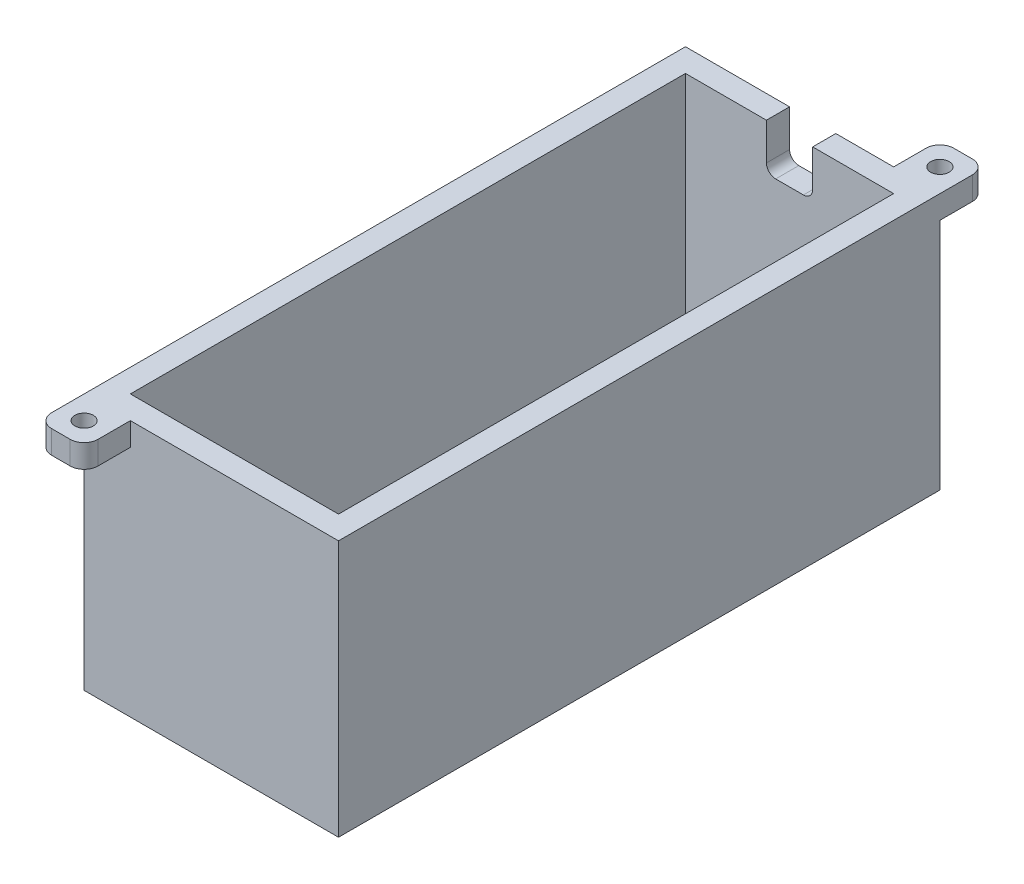
ISO-10303-21;
HEADER;
FILE_DESCRIPTION(('STEP AP214'),'2;1');
FILE_NAME('part.step','',(''),(''),'','','');
FILE_SCHEMA(('AUTOMOTIVE_DESIGN { 1 0 10303 214 1 1 1 1 }'));
ENDSEC;
DATA;
#1=APPLICATION_CONTEXT('core data for automotive mechanical design processes');
#2=APPLICATION_PROTOCOL_DEFINITION('international standard','automotive_design',2000,#1);
#3=PRODUCT_CONTEXT('',#1,'mechanical');
#4=PRODUCT('Part','Part','',(#3));
#5=PRODUCT_RELATED_PRODUCT_CATEGORY('part','',(#4));
#6=PRODUCT_DEFINITION_FORMATION('','',#4);
#7=PRODUCT_DEFINITION_CONTEXT('part definition',#1,'design');
#8=PRODUCT_DEFINITION('design','',#6,#7);
#9=PRODUCT_DEFINITION_SHAPE('','',#8);
#10=(LENGTH_UNIT() NAMED_UNIT(*) SI_UNIT(.MILLI.,.METRE.));
#11=(NAMED_UNIT(*) PLANE_ANGLE_UNIT() SI_UNIT($,.RADIAN.));
#12=(NAMED_UNIT(*) SI_UNIT($,.STERADIAN.) SOLID_ANGLE_UNIT());
#13=UNCERTAINTY_MEASURE_WITH_UNIT(LENGTH_MEASURE(1.E-05),#10,'distance_accuracy_value','');
#14=(GEOMETRIC_REPRESENTATION_CONTEXT(3) GLOBAL_UNCERTAINTY_ASSIGNED_CONTEXT((#13)) GLOBAL_UNIT_ASSIGNED_CONTEXT((#10,
#11,#12)) REPRESENTATION_CONTEXT('',''));
#15=CARTESIAN_POINT('',(0.,0.,0.));
#16=DIRECTION('',(0.,0.,1.));
#17=DIRECTION('',(1.,0.,0.));
#18=AXIS2_PLACEMENT_3D('',#15,#16,#17);
#19=CARTESIAN_POINT('',(0.,0.,0.));
#20=DIRECTION('',(0.,1.,0.));
#21=DIRECTION('',(0.,0.,1.));
#22=AXIS2_PLACEMENT_3D('',#19,#20,#21);
#23=PLANE('',#22);
#24=DIRECTION('',(0.,0.,-1.));
#25=VECTOR('',#24,1.);
#26=CARTESIAN_POINT('',(27.5,0.,0.));
#27=LINE('',#26,#25);
#28=CARTESIAN_POINT('',(27.5,0.,65.));
#29=VERTEX_POINT('',#28);
#30=CARTESIAN_POINT('',(27.5,0.,-65.));
#31=VERTEX_POINT('',#30);
#32=EDGE_CURVE('E287',#29,#31,#27,.T.);
#33=ORIENTED_EDGE('',*,*,#32,.F.);
#34=DIRECTION('',(1.,0.,0.));
#35=VECTOR('',#34,1.);
#36=CARTESIAN_POINT('',(0.,0.,65.));
#37=LINE('',#36,#35);
#38=CARTESIAN_POINT('',(-27.5,0.,65.));
#39=VERTEX_POINT('',#38);
#40=EDGE_CURVE('E296',#39,#29,#37,.T.);
#41=ORIENTED_EDGE('',*,*,#40,.F.);
#42=DIRECTION('',(0.,0.,-1.));
#43=VECTOR('',#42,1.);
#44=CARTESIAN_POINT('',(-27.5,0.,0.));
#45=LINE('',#44,#43);
#46=CARTESIAN_POINT('',(-27.5,0.,-65.));
#47=VERTEX_POINT('',#46);
#48=EDGE_CURVE('E293',#39,#47,#45,.T.);
#49=ORIENTED_EDGE('',*,*,#48,.T.);
#50=DIRECTION('',(1.,0.,0.));
#51=VECTOR('',#50,1.);
#52=CARTESIAN_POINT('',(0.,0.,-65.));
#53=LINE('',#52,#51);
#54=EDGE_CURVE('E290',#47,#31,#53,.T.);
#55=ORIENTED_EDGE('',*,*,#54,.T.);
#56=EDGE_LOOP('',(#33,#41,#49,#55));
#57=FACE_BOUND('',#56,.T.);
#58=DIRECTION('',(1.,0.,0.));
#59=VECTOR('',#58,1.);
#60=CARTESIAN_POINT('',(-19.,0.,22.65));
#61=LINE('',#60,#59);
#62=CARTESIAN_POINT('',(-19.,0.,22.65));
#63=VERTEX_POINT('',#62);
#64=CARTESIAN_POINT('',(19.,0.,22.65));
#65=VERTEX_POINT('',#64);
#66=EDGE_CURVE('E240',#63,#65,#61,.T.);
#67=ORIENTED_EDGE('',*,*,#66,.T.);
#68=DIRECTION('',(0.,0.,1.));
#69=VECTOR('',#68,1.);
#70=CARTESIAN_POINT('',(19.,0.,-22.65));
#71=LINE('',#70,#69);
#72=CARTESIAN_POINT('',(19.,0.,-22.65));
#73=VERTEX_POINT('',#72);
#74=EDGE_CURVE('E528',#73,#65,#71,.T.);
#75=ORIENTED_EDGE('',*,*,#74,.F.);
#76=DIRECTION('',(1.,0.,0.));
#77=VECTOR('',#76,1.);
#78=CARTESIAN_POINT('',(-19.,0.,-22.65));
#79=LINE('',#78,#77);
#80=CARTESIAN_POINT('',(-19.,0.,-22.65));
#81=VERTEX_POINT('',#80);
#82=EDGE_CURVE('E531',#81,#73,#79,.T.);
#83=ORIENTED_EDGE('',*,*,#82,.F.);
#84=DIRECTION('',(0.,0.,1.));
#85=VECTOR('',#84,1.);
#86=CARTESIAN_POINT('',(-19.,0.,-22.65));
#87=LINE('',#86,#85);
#88=EDGE_CURVE('E517',#81,#63,#87,.T.);
#89=ORIENTED_EDGE('',*,*,#88,.T.);
#90=EDGE_LOOP('',(#67,#75,#83,#89));
#91=FACE_BOUND('',#90,.T.);
#92=ADVANCED_FACE('F41',(#57,#91),#23,.F.);
#93=CARTESIAN_POINT('',(0.,5.,65.));
#94=DIRECTION('',(0.,0.,-1.));
#95=DIRECTION('',(-1.,0.,0.));
#96=AXIS2_PLACEMENT_3D('',#93,#94,#95);
#97=PLANE('',#96);
#98=DIRECTION('',(0.,1.,0.));
#99=VECTOR('',#98,1.);
#100=CARTESIAN_POINT('',(-17.5,50.5,65.));
#101=LINE('',#100,#99);
#102=CARTESIAN_POINT('',(-17.5,50.5,65.));
#103=VERTEX_POINT('',#102);
#104=CARTESIAN_POINT('',(-17.5,55.5,65.));
#105=VERTEX_POINT('',#104);
#106=EDGE_CURVE('E548',#103,#105,#101,.T.);
#107=ORIENTED_EDGE('',*,*,#106,.F.);
#108=DIRECTION('',(-1.,0.,0.));
#109=VECTOR('',#108,1.);
#110=CARTESIAN_POINT('',(-17.5,50.5,65.));
#111=LINE('',#110,#109);
#112=CARTESIAN_POINT('',(-27.5,50.5,65.));
#113=VERTEX_POINT('',#112);
#114=EDGE_CURVE('E457',#103,#113,#111,.T.);
#115=ORIENTED_EDGE('',*,*,#114,.T.);
#116=DIRECTION('',(0.,-1.,0.));
#117=VECTOR('',#116,1.);
#118=CARTESIAN_POINT('',(-27.5,5.,65.));
#119=LINE('',#118,#117);
#120=EDGE_CURVE('E301',#113,#39,#119,.T.);
#121=ORIENTED_EDGE('',*,*,#120,.T.);
#122=ORIENTED_EDGE('',*,*,#40,.T.);
#123=DIRECTION('',(0.,-1.,0.));
#124=VECTOR('',#123,1.);
#125=CARTESIAN_POINT('',(27.5,5.,65.));
#126=LINE('',#125,#124);
#127=CARTESIAN_POINT('',(27.5,55.5,65.));
#128=VERTEX_POINT('',#127);
#129=EDGE_CURVE('E298',#128,#29,#126,.T.);
#130=ORIENTED_EDGE('',*,*,#129,.F.);
#131=DIRECTION('',(1.,0.,0.));
#132=VECTOR('',#131,1.);
#133=CARTESIAN_POINT('',(0.,55.5,65.));
#134=LINE('',#133,#132);
#135=EDGE_CURVE('E248',#105,#128,#134,.T.);
#136=ORIENTED_EDGE('',*,*,#135,.F.);
#137=EDGE_LOOP('',(#107,#115,#121,#122,#130,#136));
#138=FACE_BOUND('',#137,.T.);
#139=ADVANCED_FACE('F386',(#138),#97,.F.);
#140=CARTESIAN_POINT('',(27.5,5.,0.));
#141=DIRECTION('',(-1.,0.,0.));
#142=DIRECTION('',(0.,0.,1.));
#143=AXIS2_PLACEMENT_3D('',#140,#141,#142);
#144=PLANE('',#143);
#145=DIRECTION('',(0.,0.,-1.));
#146=VECTOR('',#145,1.);
#147=CARTESIAN_POINT('',(27.5,50.5,-65.));
#148=LINE('',#147,#146);
#149=CARTESIAN_POINT('',(27.5,50.5,-65.));
#150=VERTEX_POINT('',#149);
#151=CARTESIAN_POINT('',(27.5,50.5,-72.));
#152=VERTEX_POINT('',#151);
#153=EDGE_CURVE('E468',#150,#152,#148,.T.);
#154=ORIENTED_EDGE('',*,*,#153,.T.);
#155=DIRECTION('',(0.,1.,0.));
#156=VECTOR('',#155,1.);
#157=CARTESIAN_POINT('',(27.5,55.5,-72.));
#158=LINE('',#157,#156);
#159=CARTESIAN_POINT('',(27.5,55.5,-72.));
#160=VERTEX_POINT('',#159);
#161=EDGE_CURVE('E338',#152,#160,#158,.T.);
#162=ORIENTED_EDGE('',*,*,#161,.T.);
#163=DIRECTION('',(0.,0.,-1.));
#164=VECTOR('',#163,1.);
#165=CARTESIAN_POINT('',(27.5,55.5,0.));
#166=LINE('',#165,#164);
#167=EDGE_CURVE('E251',#128,#160,#166,.T.);
#168=ORIENTED_EDGE('',*,*,#167,.F.);
#169=ORIENTED_EDGE('',*,*,#129,.T.);
#170=ORIENTED_EDGE('',*,*,#32,.T.);
#171=DIRECTION('',(0.,-1.,0.));
#172=VECTOR('',#171,1.);
#173=CARTESIAN_POINT('',(27.5,5.,-65.));
#174=LINE('',#173,#172);
#175=EDGE_CURVE('E305',#150,#31,#174,.T.);
#176=ORIENTED_EDGE('',*,*,#175,.F.);
#177=EDGE_LOOP('',(#154,#162,#168,#169,#170,#176));
#178=FACE_BOUND('',#177,.T.);
#179=ADVANCED_FACE('F392',(#178),#144,.F.);
#180=CARTESIAN_POINT('',(0.,5.,-65.));
#181=DIRECTION('',(0.,0.,-1.));
#182=DIRECTION('',(-1.,0.,0.));
#183=AXIS2_PLACEMENT_3D('',#180,#181,#182);
#184=PLANE('',#183);
#185=DIRECTION('',(0.,1.,0.));
#186=VECTOR('',#185,1.);
#187=CARTESIAN_POINT('',(-5.,45.5,-65.));
#188=LINE('',#187,#186);
#189=CARTESIAN_POINT('',(-5.,47.5,-65.));
#190=VERTEX_POINT('',#189);
#191=CARTESIAN_POINT('',(-5.,55.5,-65.));
#192=VERTEX_POINT('',#191);
#193=EDGE_CURVE('E237',#190,#192,#188,.T.);
#194=ORIENTED_EDGE('',*,*,#193,.F.);
#195=CARTESIAN_POINT('',(-3.,47.5,-65.));
#196=DIRECTION('',(0.,0.,-1.));
#197=DIRECTION('',(-1.,0.,0.));
#198=AXIS2_PLACEMENT_3D('',#195,#196,#197);
#199=CIRCLE('',#198,2.);
#200=CARTESIAN_POINT('',(-3.,45.5,-65.));
#201=VERTEX_POINT('',#200);
#202=EDGE_CURVE('E49',#190,#201,#199,.F.);
#203=ORIENTED_EDGE('',*,*,#202,.T.);
#204=DIRECTION('',(-1.,0.,0.));
#205=VECTOR('',#204,1.);
#206=CARTESIAN_POINT('',(5.,45.5,-65.));
#207=LINE('',#206,#205);
#208=CARTESIAN_POINT('',(3.,45.5,-65.));
#209=VERTEX_POINT('',#208);
#210=EDGE_CURVE('E371',#209,#201,#207,.T.);
#211=ORIENTED_EDGE('',*,*,#210,.F.);
#212=CARTESIAN_POINT('',(3.,47.5,-65.));
#213=DIRECTION('',(0.,0.,-1.));
#214=DIRECTION('',(-1.,0.,0.));
#215=AXIS2_PLACEMENT_3D('',#212,#213,#214);
#216=CIRCLE('',#215,2.);
#217=CARTESIAN_POINT('',(5.,47.5,-65.));
#218=VERTEX_POINT('',#217);
#219=EDGE_CURVE('E364',#209,#218,#216,.F.);
#220=ORIENTED_EDGE('',*,*,#219,.T.);
#221=DIRECTION('',(0.,-1.,0.));
#222=VECTOR('',#221,1.);
#223=CARTESIAN_POINT('',(5.,55.5,-65.));
#224=LINE('',#223,#222);
#225=CARTESIAN_POINT('',(5.,55.5,-65.));
#226=VERTEX_POINT('',#225);
#227=EDGE_CURVE('E376',#226,#218,#224,.T.);
#228=ORIENTED_EDGE('',*,*,#227,.F.);
#229=DIRECTION('',(-1.,0.,0.));
#230=VECTOR('',#229,1.);
#231=CARTESIAN_POINT('',(0.,55.5,-65.));
#232=LINE('',#231,#230);
#233=CARTESIAN_POINT('',(17.5,55.5,-65.));
#234=VERTEX_POINT('',#233);
#235=EDGE_CURVE('E259',#234,#226,#232,.T.);
#236=ORIENTED_EDGE('',*,*,#235,.F.);
#237=DIRECTION('',(0.,1.,0.));
#238=VECTOR('',#237,1.);
#239=CARTESIAN_POINT('',(17.5,50.5,-65.));
#240=LINE('',#239,#238);
#241=CARTESIAN_POINT('',(17.5,50.5,-65.));
#242=VERTEX_POINT('',#241);
#243=EDGE_CURVE('E270',#242,#234,#240,.T.);
#244=ORIENTED_EDGE('',*,*,#243,.F.);
#245=DIRECTION('',(1.,0.,0.));
#246=VECTOR('',#245,1.);
#247=CARTESIAN_POINT('',(17.5,50.5,-65.));
#248=LINE('',#247,#246);
#249=EDGE_CURVE('E465',#242,#150,#248,.T.);
#250=ORIENTED_EDGE('',*,*,#249,.T.);
#251=ORIENTED_EDGE('',*,*,#175,.T.);
#252=ORIENTED_EDGE('',*,*,#54,.F.);
#253=DIRECTION('',(0.,-1.,0.));
#254=VECTOR('',#253,1.);
#255=CARTESIAN_POINT('',(-27.5,5.,-65.));
#256=LINE('',#255,#254);
#257=CARTESIAN_POINT('',(-27.5,55.5,-65.));
#258=VERTEX_POINT('',#257);
#259=EDGE_CURVE('E303',#258,#47,#256,.T.);
#260=ORIENTED_EDGE('',*,*,#259,.F.);
#261=EDGE_CURVE('E258',#192,#258,#232,.T.);
#262=ORIENTED_EDGE('',*,*,#261,.F.);
#263=EDGE_LOOP('',(#194,#203,#211,#220,#228,#236,#244,#250,#251,#252,#260,#262));
#264=FACE_BOUND('',#263,.T.);
#265=ADVANCED_FACE('F370',(#264),#184,.T.);
#266=CARTESIAN_POINT('',(-27.5,5.,0.));
#267=DIRECTION('',(-1.,0.,0.));
#268=DIRECTION('',(0.,0.,1.));
#269=AXIS2_PLACEMENT_3D('',#266,#267,#268);
#270=PLANE('',#269);
#271=DIRECTION('',(0.,0.,1.));
#272=VECTOR('',#271,1.);
#273=CARTESIAN_POINT('',(-27.5,50.5,65.));
#274=LINE('',#273,#272);
#275=CARTESIAN_POINT('',(-27.5,50.5,72.));
#276=VERTEX_POINT('',#275);
#277=EDGE_CURVE('E450',#113,#276,#274,.T.);
#278=ORIENTED_EDGE('',*,*,#277,.T.);
#279=DIRECTION('',(0.,1.,0.));
#280=VECTOR('',#279,1.);
#281=CARTESIAN_POINT('',(-27.5,5.,72.));
#282=LINE('',#281,#280);
#283=CARTESIAN_POINT('',(-27.5,55.5,72.));
#284=VERTEX_POINT('',#283);
#285=EDGE_CURVE('E352',#276,#284,#282,.T.);
#286=ORIENTED_EDGE('',*,*,#285,.T.);
#287=DIRECTION('',(0.,0.,1.));
#288=VECTOR('',#287,1.);
#289=CARTESIAN_POINT('',(-27.5,55.5,0.));
#290=LINE('',#289,#288);
#291=EDGE_CURVE('E262',#258,#284,#290,.T.);
#292=ORIENTED_EDGE('',*,*,#291,.F.);
#293=ORIENTED_EDGE('',*,*,#259,.T.);
#294=ORIENTED_EDGE('',*,*,#48,.F.);
#295=ORIENTED_EDGE('',*,*,#120,.F.);
#296=EDGE_LOOP('',(#278,#286,#292,#293,#294,#295));
#297=FACE_BOUND('',#296,.T.);
#298=ADVANCED_FACE('F401',(#297),#270,.T.);
#299=CARTESIAN_POINT('',(22.5,55.5,0.));
#300=DIRECTION('',(-1.,0.,0.));
#301=DIRECTION('',(0.,0.,1.));
#302=AXIS2_PLACEMENT_3D('',#299,#300,#301);
#303=PLANE('',#302);
#304=DIRECTION('',(0.,0.,-1.));
#305=VECTOR('',#304,1.);
#306=CARTESIAN_POINT('',(22.5,5.,0.));
#307=LINE('',#306,#305);
#308=CARTESIAN_POINT('',(22.5,5.,60.));
#309=VERTEX_POINT('',#308);
#310=CARTESIAN_POINT('',(22.5,5.,-60.));
#311=VERTEX_POINT('',#310);
#312=EDGE_CURVE('E266',#309,#311,#307,.T.);
#313=ORIENTED_EDGE('',*,*,#312,.F.);
#314=DIRECTION('',(0.,-1.,0.));
#315=VECTOR('',#314,1.);
#316=CARTESIAN_POINT('',(22.5,55.5,60.));
#317=LINE('',#316,#315);
#318=CARTESIAN_POINT('',(22.5,55.5,60.));
#319=VERTEX_POINT('',#318);
#320=EDGE_CURVE('E285',#319,#309,#317,.T.);
#321=ORIENTED_EDGE('',*,*,#320,.F.);
#322=DIRECTION('',(0.,0.,-1.));
#323=VECTOR('',#322,1.);
#324=CARTESIAN_POINT('',(22.5,55.5,0.));
#325=LINE('',#324,#323);
#326=CARTESIAN_POINT('',(22.5,55.5,-60.));
#327=VERTEX_POINT('',#326);
#328=EDGE_CURVE('E279',#319,#327,#325,.T.);
#329=ORIENTED_EDGE('',*,*,#328,.T.);
#330=DIRECTION('',(0.,-1.,0.));
#331=VECTOR('',#330,1.);
#332=CARTESIAN_POINT('',(22.5,55.5,-60.));
#333=LINE('',#332,#331);
#334=EDGE_CURVE('E265',#327,#311,#333,.T.);
#335=ORIENTED_EDGE('',*,*,#334,.T.);
#336=EDGE_LOOP('',(#313,#321,#329,#335));
#337=FACE_BOUND('',#336,.T.);
#338=ADVANCED_FACE('F404',(#337),#303,.T.);
#339=CARTESIAN_POINT('',(0.,55.5,60.));
#340=DIRECTION('',(0.,0.,-1.));
#341=DIRECTION('',(-1.,0.,0.));
#342=AXIS2_PLACEMENT_3D('',#339,#340,#341);
#343=PLANE('',#342);
#344=DIRECTION('',(1.,0.,0.));
#345=VECTOR('',#344,1.);
#346=CARTESIAN_POINT('',(0.,5.,60.));
#347=LINE('',#346,#345);
#348=CARTESIAN_POINT('',(-22.5,5.,60.));
#349=VERTEX_POINT('',#348);
#350=EDGE_CURVE('E269',#349,#309,#347,.T.);
#351=ORIENTED_EDGE('',*,*,#350,.F.);
#352=DIRECTION('',(0.,-1.,0.));
#353=VECTOR('',#352,1.);
#354=CARTESIAN_POINT('',(-22.5,55.5,60.));
#355=LINE('',#354,#353);
#356=CARTESIAN_POINT('',(-22.5,55.5,60.));
#357=VERTEX_POINT('',#356);
#358=EDGE_CURVE('E283',#357,#349,#355,.T.);
#359=ORIENTED_EDGE('',*,*,#358,.F.);
#360=DIRECTION('',(1.,0.,0.));
#361=VECTOR('',#360,1.);
#362=CARTESIAN_POINT('',(0.,55.5,60.));
#363=LINE('',#362,#361);
#364=EDGE_CURVE('E485',#357,#319,#363,.T.);
#365=ORIENTED_EDGE('',*,*,#364,.T.);
#366=ORIENTED_EDGE('',*,*,#320,.T.);
#367=EDGE_LOOP('',(#351,#359,#365,#366));
#368=FACE_BOUND('',#367,.T.);
#369=ADVANCED_FACE('F489',(#368),#343,.T.);
#370=CARTESIAN_POINT('',(-22.5,55.5,0.));
#371=DIRECTION('',(-1.,0.,0.));
#372=DIRECTION('',(0.,0.,1.));
#373=AXIS2_PLACEMENT_3D('',#370,#371,#372);
#374=PLANE('',#373);
#375=DIRECTION('',(0.,0.,-1.));
#376=VECTOR('',#375,1.);
#377=CARTESIAN_POINT('',(-22.5,5.,0.));
#378=LINE('',#377,#376);
#379=CARTESIAN_POINT('',(-22.5,5.,-60.));
#380=VERTEX_POINT('',#379);
#381=EDGE_CURVE('E273',#349,#380,#378,.T.);
#382=ORIENTED_EDGE('',*,*,#381,.T.);
#383=DIRECTION('',(0.,-1.,0.));
#384=VECTOR('',#383,1.);
#385=CARTESIAN_POINT('',(-22.5,55.5,-60.));
#386=LINE('',#385,#384);
#387=CARTESIAN_POINT('',(-22.5,55.5,-60.));
#388=VERTEX_POINT('',#387);
#389=EDGE_CURVE('E281',#388,#380,#386,.T.);
#390=ORIENTED_EDGE('',*,*,#389,.F.);
#391=DIRECTION('',(0.,0.,-1.));
#392=VECTOR('',#391,1.);
#393=CARTESIAN_POINT('',(-22.5,55.5,0.));
#394=LINE('',#393,#392);
#395=EDGE_CURVE('E246',#357,#388,#394,.T.);
#396=ORIENTED_EDGE('',*,*,#395,.F.);
#397=ORIENTED_EDGE('',*,*,#358,.T.);
#398=EDGE_LOOP('',(#382,#390,#396,#397));
#399=FACE_BOUND('',#398,.T.);
#400=ADVANCED_FACE('F500',(#399),#374,.F.);
#401=CARTESIAN_POINT('',(0.,55.5,-60.));
#402=DIRECTION('',(0.,0.,-1.));
#403=DIRECTION('',(-1.,0.,0.));
#404=AXIS2_PLACEMENT_3D('',#401,#402,#403);
#405=PLANE('',#404);
#406=DIRECTION('',(0.,-1.,0.));
#407=VECTOR('',#406,1.);
#408=CARTESIAN_POINT('',(5.,55.5,-60.));
#409=LINE('',#408,#407);
#410=CARTESIAN_POINT('',(5.,55.5,-60.));
#411=VERTEX_POINT('',#410);
#412=CARTESIAN_POINT('',(5.,47.5,-60.));
#413=VERTEX_POINT('',#412);
#414=EDGE_CURVE('E501',#411,#413,#409,.T.);
#415=ORIENTED_EDGE('',*,*,#414,.T.);
#416=CARTESIAN_POINT('',(3.,47.5,-60.));
#417=DIRECTION('',(0.,0.,-1.));
#418=DIRECTION('',(-1.,0.,0.));
#419=AXIS2_PLACEMENT_3D('',#416,#417,#418);
#420=CIRCLE('',#419,2.);
#421=CARTESIAN_POINT('',(3.,45.5,-60.));
#422=VERTEX_POINT('',#421);
#423=EDGE_CURVE('E366',#413,#422,#420,.T.);
#424=ORIENTED_EDGE('',*,*,#423,.T.);
#425=DIRECTION('',(-1.,0.,0.));
#426=VECTOR('',#425,1.);
#427=CARTESIAN_POINT('',(5.,45.5,-60.));
#428=LINE('',#427,#426);
#429=CARTESIAN_POINT('',(-3.,45.5,-60.));
#430=VERTEX_POINT('',#429);
#431=EDGE_CURVE('E231',#422,#430,#428,.T.);
#432=ORIENTED_EDGE('',*,*,#431,.T.);
#433=CARTESIAN_POINT('',(-3.,47.5,-60.));
#434=DIRECTION('',(0.,0.,-1.));
#435=DIRECTION('',(-1.,0.,0.));
#436=AXIS2_PLACEMENT_3D('',#433,#434,#435);
#437=CIRCLE('',#436,2.);
#438=CARTESIAN_POINT('',(-5.,47.5,-60.));
#439=VERTEX_POINT('',#438);
#440=EDGE_CURVE('E11',#430,#439,#437,.T.);
#441=ORIENTED_EDGE('',*,*,#440,.T.);
#442=DIRECTION('',(0.,1.,0.));
#443=VECTOR('',#442,1.);
#444=CARTESIAN_POINT('',(-5.,45.5,-60.));
#445=LINE('',#444,#443);
#446=CARTESIAN_POINT('',(-5.,55.5,-60.));
#447=VERTEX_POINT('',#446);
#448=EDGE_CURVE('E223',#439,#447,#445,.T.);
#449=ORIENTED_EDGE('',*,*,#448,.T.);
#450=DIRECTION('',(1.,0.,0.));
#451=VECTOR('',#450,1.);
#452=CARTESIAN_POINT('',(0.,55.5,-60.));
#453=LINE('',#452,#451);
#454=EDGE_CURVE('E228',#388,#447,#453,.T.);
#455=ORIENTED_EDGE('',*,*,#454,.F.);
#456=ORIENTED_EDGE('',*,*,#389,.T.);
#457=DIRECTION('',(1.,0.,0.));
#458=VECTOR('',#457,1.);
#459=CARTESIAN_POINT('',(0.,5.,-60.));
#460=LINE('',#459,#458);
#461=EDGE_CURVE('E276',#380,#311,#460,.T.);
#462=ORIENTED_EDGE('',*,*,#461,.T.);
#463=ORIENTED_EDGE('',*,*,#334,.F.);
#464=EDGE_CURVE('E249',#411,#327,#453,.T.);
#465=ORIENTED_EDGE('',*,*,#464,.F.);
#466=EDGE_LOOP('',(#415,#424,#432,#441,#449,#455,#456,#462,#463,#465));
#467=FACE_BOUND('',#466,.T.);
#468=ADVANCED_FACE('F226',(#467),#405,.F.);
#469=CARTESIAN_POINT('',(0.,55.5,0.));
#470=DIRECTION('',(0.,1.,0.));
#471=DIRECTION('',(0.,0.,1.));
#472=AXIS2_PLACEMENT_3D('',#469,#470,#471);
#473=PLANE('',#472);
#474=DIRECTION('',(0.,0.,-1.));
#475=VECTOR('',#474,1.);
#476=CARTESIAN_POINT('',(-5.,55.5,-60.));
#477=LINE('',#476,#475);
#478=EDGE_CURVE('E234',#447,#192,#477,.T.);
#479=ORIENTED_EDGE('',*,*,#478,.T.);
#480=ORIENTED_EDGE('',*,*,#261,.T.);
#481=ORIENTED_EDGE('',*,*,#291,.T.);
#482=CARTESIAN_POINT('',(-24.5,55.5,72.));
#483=DIRECTION('',(0.,1.,0.));
#484=DIRECTION('',(0.,0.,1.));
#485=AXIS2_PLACEMENT_3D('',#482,#483,#484);
#486=CIRCLE('',#485,3.);
#487=CARTESIAN_POINT('',(-24.5,55.5,75.));
#488=VERTEX_POINT('',#487);
#489=EDGE_CURVE('E324',#284,#488,#486,.T.);
#490=ORIENTED_EDGE('',*,*,#489,.T.);
#491=DIRECTION('',(1.,0.,0.));
#492=VECTOR('',#491,1.);
#493=CARTESIAN_POINT('',(-27.5,55.5,75.));
#494=LINE('',#493,#492);
#495=CARTESIAN_POINT('',(-20.5,55.5,75.));
#496=VERTEX_POINT('',#495);
#497=EDGE_CURVE('E480',#488,#496,#494,.T.);
#498=ORIENTED_EDGE('',*,*,#497,.T.);
#499=CARTESIAN_POINT('',(-20.5,55.5,72.));
#500=DIRECTION('',(0.,1.,0.));
#501=DIRECTION('',(0.,0.,1.));
#502=AXIS2_PLACEMENT_3D('',#499,#500,#501);
#503=CIRCLE('',#502,3.);
#504=CARTESIAN_POINT('',(-17.5,55.5,72.));
#505=VERTEX_POINT('',#504);
#506=EDGE_CURVE('E326',#496,#505,#503,.T.);
#507=ORIENTED_EDGE('',*,*,#506,.T.);
#508=DIRECTION('',(0.,0.,-1.));
#509=VECTOR('',#508,1.);
#510=CARTESIAN_POINT('',(-17.5,55.5,75.));
#511=LINE('',#510,#509);
#512=EDGE_CURVE('E459',#505,#105,#511,.T.);
#513=ORIENTED_EDGE('',*,*,#512,.T.);
#514=ORIENTED_EDGE('',*,*,#135,.T.);
#515=ORIENTED_EDGE('',*,*,#167,.T.);
#516=CARTESIAN_POINT('',(24.5,55.5,-72.));
#517=DIRECTION('',(0.,1.,0.));
#518=DIRECTION('',(0.,0.,1.));
#519=AXIS2_PLACEMENT_3D('',#516,#517,#518);
#520=CIRCLE('',#519,3.);
#521=CARTESIAN_POINT('',(24.5,55.5,-75.));
#522=VERTEX_POINT('',#521);
#523=EDGE_CURVE('E328',#160,#522,#520,.T.);
#524=ORIENTED_EDGE('',*,*,#523,.T.);
#525=DIRECTION('',(-1.,0.,0.));
#526=VECTOR('',#525,1.);
#527=CARTESIAN_POINT('',(27.5,55.5,-75.));
#528=LINE('',#527,#526);
#529=CARTESIAN_POINT('',(20.5,55.5,-75.));
#530=VERTEX_POINT('',#529);
#531=EDGE_CURVE('E477',#522,#530,#528,.T.);
#532=ORIENTED_EDGE('',*,*,#531,.T.);
#533=CARTESIAN_POINT('',(20.5,55.5,-72.));
#534=DIRECTION('',(0.,1.,0.));
#535=DIRECTION('',(0.,0.,1.));
#536=AXIS2_PLACEMENT_3D('',#533,#534,#535);
#537=CIRCLE('',#536,3.);
#538=CARTESIAN_POINT('',(17.5,55.5,-72.));
#539=VERTEX_POINT('',#538);
#540=EDGE_CURVE('E330',#530,#539,#537,.T.);
#541=ORIENTED_EDGE('',*,*,#540,.T.);
#542=DIRECTION('',(0.,0.,1.));
#543=VECTOR('',#542,1.);
#544=CARTESIAN_POINT('',(17.5,55.5,-75.));
#545=LINE('',#544,#543);
#546=EDGE_CURVE('E469',#539,#234,#545,.T.);
#547=ORIENTED_EDGE('',*,*,#546,.T.);
#548=ORIENTED_EDGE('',*,*,#235,.T.);
#549=DIRECTION('',(0.,0.,-1.));
#550=VECTOR('',#549,1.);
#551=CARTESIAN_POINT('',(5.,55.5,-60.));
#552=LINE('',#551,#550);
#553=EDGE_CURVE('E230',#411,#226,#552,.T.);
#554=ORIENTED_EDGE('',*,*,#553,.F.);
#555=ORIENTED_EDGE('',*,*,#464,.T.);
#556=ORIENTED_EDGE('',*,*,#328,.F.);
#557=ORIENTED_EDGE('',*,*,#364,.F.);
#558=ORIENTED_EDGE('',*,*,#395,.T.);
#559=ORIENTED_EDGE('',*,*,#454,.T.);
#560=EDGE_LOOP('',(#479,#480,#481,#490,#498,#507,#513,#514,#515,#524,#532,#541,#547,#548,#554,
#555,#556,#557,#558,#559));
#561=FACE_BOUND('',#560,.T.);
#562=CARTESIAN_POINT('',(-22.5,55.5,70.));
#563=DIRECTION('',(0.,-1.,0.));
#564=DIRECTION('',(0.,0.,-1.));
#565=AXIS2_PLACEMENT_3D('',#562,#563,#564);
#566=CIRCLE('',#565,2.);
#567=CARTESIAN_POINT('',(-22.5,55.5,68.));
#568=VERTEX_POINT('',#567);
#569=EDGE_CURVE('E545',#568,#568,#566,.T.);
#570=ORIENTED_EDGE('',*,*,#569,.T.);
#571=EDGE_LOOP('',(#570));
#572=FACE_BOUND('',#571,.T.);
#573=CARTESIAN_POINT('',(22.5,55.5,-70.));
#574=DIRECTION('',(0.,-1.,0.));
#575=DIRECTION('',(0.,0.,-1.));
#576=AXIS2_PLACEMENT_3D('',#573,#574,#575);
#577=CIRCLE('',#576,2.);
#578=CARTESIAN_POINT('',(22.5,55.5,-72.));
#579=VERTEX_POINT('',#578);
#580=EDGE_CURVE('E544',#579,#579,#577,.T.);
#581=ORIENTED_EDGE('',*,*,#580,.T.);
#582=EDGE_LOOP('',(#581));
#583=FACE_BOUND('',#582,.T.);
#584=ADVANCED_FACE('F242',(#561,#572,#583),#473,.T.);
#585=CARTESIAN_POINT('',(0.,5.,0.));
#586=DIRECTION('',(0.,1.,0.));
#587=DIRECTION('',(0.,0.,1.));
#588=AXIS2_PLACEMENT_3D('',#585,#586,#587);
#589=PLANE('',#588);
#590=DIRECTION('',(1.,0.,0.));
#591=VECTOR('',#590,1.);
#592=CARTESIAN_POINT('',(-19.,5.,22.65));
#593=LINE('',#592,#591);
#594=CARTESIAN_POINT('',(-19.,5.,22.65));
#595=VERTEX_POINT('',#594);
#596=CARTESIAN_POINT('',(19.,5.,22.65));
#597=VERTEX_POINT('',#596);
#598=EDGE_CURVE('E514',#595,#597,#593,.T.);
#599=ORIENTED_EDGE('',*,*,#598,.F.);
#600=DIRECTION('',(0.,0.,1.));
#601=VECTOR('',#600,1.);
#602=CARTESIAN_POINT('',(-19.,5.,-22.65));
#603=LINE('',#602,#601);
#604=CARTESIAN_POINT('',(-19.,5.,-22.65));
#605=VERTEX_POINT('',#604);
#606=EDGE_CURVE('E523',#605,#595,#603,.T.);
#607=ORIENTED_EDGE('',*,*,#606,.F.);
#608=DIRECTION('',(1.,0.,0.));
#609=VECTOR('',#608,1.);
#610=CARTESIAN_POINT('',(-19.,5.,-22.65));
#611=LINE('',#610,#609);
#612=CARTESIAN_POINT('',(19.,5.,-22.65));
#613=VERTEX_POINT('',#612);
#614=EDGE_CURVE('E520',#605,#613,#611,.T.);
#615=ORIENTED_EDGE('',*,*,#614,.T.);
#616=DIRECTION('',(0.,0.,1.));
#617=VECTOR('',#616,1.);
#618=CARTESIAN_POINT('',(19.,5.,-22.65));
#619=LINE('',#618,#617);
#620=EDGE_CURVE('E516',#613,#597,#619,.T.);
#621=ORIENTED_EDGE('',*,*,#620,.T.);
#622=EDGE_LOOP('',(#599,#607,#615,#621));
#623=FACE_BOUND('',#622,.T.);
#624=ORIENTED_EDGE('',*,*,#312,.T.);
#625=ORIENTED_EDGE('',*,*,#461,.F.);
#626=ORIENTED_EDGE('',*,*,#381,.F.);
#627=ORIENTED_EDGE('',*,*,#350,.T.);
#628=EDGE_LOOP('',(#624,#625,#626,#627));
#629=FACE_BOUND('',#628,.T.);
#630=ADVANCED_FACE('F398',(#623,#629),#589,.T.);
#631=CARTESIAN_POINT('',(17.5,50.5,-75.));
#632=DIRECTION('',(-1.,0.,0.));
#633=DIRECTION('',(0.,0.,1.));
#634=AXIS2_PLACEMENT_3D('',#631,#632,#633);
#635=PLANE('',#634);
#636=ORIENTED_EDGE('',*,*,#546,.F.);
#637=DIRECTION('',(0.,1.,0.));
#638=VECTOR('',#637,1.);
#639=CARTESIAN_POINT('',(17.5,50.5,-72.));
#640=LINE('',#639,#638);
#641=CARTESIAN_POINT('',(17.5,50.5,-72.));
#642=VERTEX_POINT('',#641);
#643=EDGE_CURVE('E332',#539,#642,#640,.F.);
#644=ORIENTED_EDGE('',*,*,#643,.T.);
#645=DIRECTION('',(0.,0.,1.));
#646=VECTOR('',#645,1.);
#647=CARTESIAN_POINT('',(17.5,50.5,-75.));
#648=LINE('',#647,#646);
#649=EDGE_CURVE('E475',#642,#242,#648,.T.);
#650=ORIENTED_EDGE('',*,*,#649,.T.);
#651=ORIENTED_EDGE('',*,*,#243,.T.);
#652=EDGE_LOOP('',(#636,#644,#650,#651));
#653=FACE_BOUND('',#652,.T.);
#654=ADVANCED_FACE('F584',(#653),#635,.T.);
#655=CARTESIAN_POINT('',(27.5,50.5,-75.));
#656=DIRECTION('',(0.,0.,-1.));
#657=DIRECTION('',(-1.,0.,0.));
#658=AXIS2_PLACEMENT_3D('',#655,#656,#657);
#659=PLANE('',#658);
#660=DIRECTION('',(-1.,0.,0.));
#661=VECTOR('',#660,1.);
#662=CARTESIAN_POINT('',(27.5,50.5,-75.));
#663=LINE('',#662,#661);
#664=CARTESIAN_POINT('',(24.5,50.5,-75.));
#665=VERTEX_POINT('',#664);
#666=CARTESIAN_POINT('',(20.5,50.5,-75.));
#667=VERTEX_POINT('',#666);
#668=EDGE_CURVE('E472',#665,#667,#663,.T.);
#669=ORIENTED_EDGE('',*,*,#668,.T.);
#670=DIRECTION('',(0.,1.,0.));
#671=VECTOR('',#670,1.);
#672=CARTESIAN_POINT('',(20.5,50.5,-75.));
#673=LINE('',#672,#671);
#674=EDGE_CURVE('E321',#667,#530,#673,.T.);
#675=ORIENTED_EDGE('',*,*,#674,.T.);
#676=ORIENTED_EDGE('',*,*,#531,.F.);
#677=DIRECTION('',(0.,1.,0.));
#678=VECTOR('',#677,1.);
#679=CARTESIAN_POINT('',(24.5,50.5,-75.));
#680=LINE('',#679,#678);
#681=EDGE_CURVE('E319',#522,#665,#680,.F.);
#682=ORIENTED_EDGE('',*,*,#681,.T.);
#683=EDGE_LOOP('',(#669,#675,#676,#682));
#684=FACE_BOUND('',#683,.T.);
#685=ADVANCED_FACE('F577',(#684),#659,.T.);
#686=CARTESIAN_POINT('',(0.,50.5,0.));
#687=DIRECTION('',(0.,1.,0.));
#688=DIRECTION('',(0.,0.,1.));
#689=AXIS2_PLACEMENT_3D('',#686,#687,#688);
#690=PLANE('',#689);
#691=CARTESIAN_POINT('',(22.5,50.5,-70.));
#692=DIRECTION('',(0.,1.,0.));
#693=DIRECTION('',(0.,0.,1.));
#694=AXIS2_PLACEMENT_3D('',#691,#692,#693);
#695=CIRCLE('',#694,3.);
#696=CARTESIAN_POINT('',(22.5,50.5,-67.));
#697=VERTEX_POINT('',#696);
#698=EDGE_CURVE('E310',#697,#697,#695,.T.);
#699=ORIENTED_EDGE('',*,*,#698,.T.);
#700=EDGE_LOOP('',(#699));
#701=FACE_BOUND('',#700,.T.);
#702=ORIENTED_EDGE('',*,*,#649,.F.);
#703=CARTESIAN_POINT('',(20.5,50.5,-72.));
#704=DIRECTION('',(0.,1.,0.));
#705=DIRECTION('',(0.,0.,1.));
#706=AXIS2_PLACEMENT_3D('',#703,#704,#705);
#707=CIRCLE('',#706,3.);
#708=EDGE_CURVE('E336',#642,#667,#707,.F.);
#709=ORIENTED_EDGE('',*,*,#708,.T.);
#710=ORIENTED_EDGE('',*,*,#668,.F.);
#711=CARTESIAN_POINT('',(24.5,50.5,-72.));
#712=DIRECTION('',(0.,1.,0.));
#713=DIRECTION('',(0.,0.,1.));
#714=AXIS2_PLACEMENT_3D('',#711,#712,#713);
#715=CIRCLE('',#714,3.);
#716=EDGE_CURVE('E334',#665,#152,#715,.F.);
#717=ORIENTED_EDGE('',*,*,#716,.T.);
#718=ORIENTED_EDGE('',*,*,#153,.F.);
#719=ORIENTED_EDGE('',*,*,#249,.F.);
#720=EDGE_LOOP('',(#702,#709,#710,#717,#718,#719));
#721=FACE_BOUND('',#720,.T.);
#722=ADVANCED_FACE('F589',(#701,#721),#690,.F.);
#723=CARTESIAN_POINT('',(-17.5,50.5,75.));
#724=DIRECTION('',(1.,0.,0.));
#725=DIRECTION('',(0.,0.,-1.));
#726=AXIS2_PLACEMENT_3D('',#723,#724,#725);
#727=PLANE('',#726);
#728=ORIENTED_EDGE('',*,*,#512,.F.);
#729=DIRECTION('',(0.,1.,0.));
#730=VECTOR('',#729,1.);
#731=CARTESIAN_POINT('',(-17.5,50.5,72.));
#732=LINE('',#731,#730);
#733=CARTESIAN_POINT('',(-17.5,50.5,72.));
#734=VERTEX_POINT('',#733);
#735=EDGE_CURVE('E346',#505,#734,#732,.F.);
#736=ORIENTED_EDGE('',*,*,#735,.T.);
#737=DIRECTION('',(0.,0.,-1.));
#738=VECTOR('',#737,1.);
#739=CARTESIAN_POINT('',(-17.5,50.5,75.));
#740=LINE('',#739,#738);
#741=EDGE_CURVE('E461',#734,#103,#740,.T.);
#742=ORIENTED_EDGE('',*,*,#741,.T.);
#743=ORIENTED_EDGE('',*,*,#106,.T.);
#744=EDGE_LOOP('',(#728,#736,#742,#743));
#745=FACE_BOUND('',#744,.T.);
#746=ADVANCED_FACE('F557',(#745),#727,.T.);
#747=CARTESIAN_POINT('',(-27.5,50.5,75.));
#748=DIRECTION('',(0.,0.,1.));
#749=DIRECTION('',(1.,0.,0.));
#750=AXIS2_PLACEMENT_3D('',#747,#748,#749);
#751=PLANE('',#750);
#752=DIRECTION('',(1.,0.,0.));
#753=VECTOR('',#752,1.);
#754=CARTESIAN_POINT('',(-27.5,50.5,75.));
#755=LINE('',#754,#753);
#756=CARTESIAN_POINT('',(-24.5,50.5,75.));
#757=VERTEX_POINT('',#756);
#758=CARTESIAN_POINT('',(-20.5,50.5,75.));
#759=VERTEX_POINT('',#758);
#760=EDGE_CURVE('E453',#757,#759,#755,.T.);
#761=ORIENTED_EDGE('',*,*,#760,.T.);
#762=DIRECTION('',(0.,1.,0.));
#763=VECTOR('',#762,1.);
#764=CARTESIAN_POINT('',(-20.5,50.5,75.));
#765=LINE('',#764,#763);
#766=EDGE_CURVE('E343',#759,#496,#765,.T.);
#767=ORIENTED_EDGE('',*,*,#766,.T.);
#768=ORIENTED_EDGE('',*,*,#497,.F.);
#769=DIRECTION('',(0.,1.,0.));
#770=VECTOR('',#769,1.);
#771=CARTESIAN_POINT('',(-24.5,50.5,75.));
#772=LINE('',#771,#770);
#773=EDGE_CURVE('E341',#488,#757,#772,.F.);
#774=ORIENTED_EDGE('',*,*,#773,.T.);
#775=EDGE_LOOP('',(#761,#767,#768,#774));
#776=FACE_BOUND('',#775,.T.);
#777=ADVANCED_FACE('F566',(#776),#751,.T.);
#778=CARTESIAN_POINT('',(0.,50.5,0.));
#779=DIRECTION('',(0.,1.,0.));
#780=DIRECTION('',(0.,0.,1.));
#781=AXIS2_PLACEMENT_3D('',#778,#779,#780);
#782=PLANE('',#781);
#783=CARTESIAN_POINT('',(-22.5,50.5,70.));
#784=DIRECTION('',(0.,1.,0.));
#785=DIRECTION('',(0.,0.,1.));
#786=AXIS2_PLACEMENT_3D('',#783,#784,#785);
#787=CIRCLE('',#786,3.);
#788=CARTESIAN_POINT('',(-22.5,50.5,73.));
#789=VERTEX_POINT('',#788);
#790=EDGE_CURVE('E316',#789,#789,#787,.T.);
#791=ORIENTED_EDGE('',*,*,#790,.T.);
#792=EDGE_LOOP('',(#791));
#793=FACE_BOUND('',#792,.T.);
#794=ORIENTED_EDGE('',*,*,#741,.F.);
#795=CARTESIAN_POINT('',(-20.5,50.5,72.));
#796=DIRECTION('',(0.,1.,0.));
#797=DIRECTION('',(0.,0.,1.));
#798=AXIS2_PLACEMENT_3D('',#795,#796,#797);
#799=CIRCLE('',#798,3.);
#800=EDGE_CURVE('E350',#734,#759,#799,.F.);
#801=ORIENTED_EDGE('',*,*,#800,.T.);
#802=ORIENTED_EDGE('',*,*,#760,.F.);
#803=CARTESIAN_POINT('',(-24.5,50.5,72.));
#804=DIRECTION('',(0.,1.,0.));
#805=DIRECTION('',(0.,0.,1.));
#806=AXIS2_PLACEMENT_3D('',#803,#804,#805);
#807=CIRCLE('',#806,3.);
#808=EDGE_CURVE('E348',#757,#276,#807,.F.);
#809=ORIENTED_EDGE('',*,*,#808,.T.);
#810=ORIENTED_EDGE('',*,*,#277,.F.);
#811=ORIENTED_EDGE('',*,*,#114,.F.);
#812=EDGE_LOOP('',(#794,#801,#802,#809,#810,#811));
#813=FACE_BOUND('',#812,.T.);
#814=ADVANCED_FACE('F448',(#793,#813),#782,.F.);
#815=CARTESIAN_POINT('',(-22.5,55.5,70.));
#816=DIRECTION('',(0.,-1.,0.));
#817=DIRECTION('',(0.,0.,-1.));
#818=AXIS2_PLACEMENT_3D('',#815,#816,#817);
#819=CYLINDRICAL_SURFACE('',#818,2.);
#820=CARTESIAN_POINT('',(-22.5,51.5,70.));
#821=DIRECTION('',(0.,1.,0.));
#822=DIRECTION('',(0.,0.,1.));
#823=AXIS2_PLACEMENT_3D('',#820,#821,#822);
#824=CIRCLE('',#823,2.);
#825=CARTESIAN_POINT('',(-22.5,51.5,72.));
#826=VERTEX_POINT('',#825);
#827=EDGE_CURVE('E313',#826,#826,#824,.F.);
#828=ORIENTED_EDGE('',*,*,#827,.T.);
#829=EDGE_LOOP('',(#828));
#830=FACE_BOUND('',#829,.T.);
#831=ORIENTED_EDGE('',*,*,#569,.F.);
#832=EDGE_LOOP('',(#831));
#833=FACE_BOUND('',#832,.T.);
#834=ADVANCED_FACE('F687',(#830,#833),#819,.F.);
#835=CARTESIAN_POINT('',(22.5,55.5,-70.));
#836=DIRECTION('',(0.,-1.,0.));
#837=DIRECTION('',(0.,0.,-1.));
#838=AXIS2_PLACEMENT_3D('',#835,#836,#837);
#839=CYLINDRICAL_SURFACE('',#838,2.);
#840=CARTESIAN_POINT('',(22.5,51.5,-70.));
#841=DIRECTION('',(0.,1.,0.));
#842=DIRECTION('',(0.,0.,1.));
#843=AXIS2_PLACEMENT_3D('',#840,#841,#842);
#844=CIRCLE('',#843,2.);
#845=CARTESIAN_POINT('',(22.5,51.5,-68.));
#846=VERTEX_POINT('',#845);
#847=EDGE_CURVE('E307',#846,#846,#844,.F.);
#848=ORIENTED_EDGE('',*,*,#847,.T.);
#849=EDGE_LOOP('',(#848));
#850=FACE_BOUND('',#849,.T.);
#851=ORIENTED_EDGE('',*,*,#580,.F.);
#852=EDGE_LOOP('',(#851));
#853=FACE_BOUND('',#852,.T.);
#854=ADVANCED_FACE('F415',(#850,#853),#839,.F.);
#855=CARTESIAN_POINT('',(22.5,51.5,-70.));
#856=DIRECTION('',(0.,1.,0.));
#857=DIRECTION('',(0.,0.,1.));
#858=AXIS2_PLACEMENT_3D('',#855,#856,#857);
#859=TOROIDAL_SURFACE('',#858,3.,1.);
#860=ORIENTED_EDGE('',*,*,#698,.F.);
#861=EDGE_LOOP('',(#860));
#862=FACE_BOUND('',#861,.T.);
#863=ORIENTED_EDGE('',*,*,#847,.F.);
#864=EDGE_LOOP('',(#863));
#865=FACE_BOUND('',#864,.T.);
#866=ADVANCED_FACE('F411',(#862,#865),#859,.T.);
#867=CARTESIAN_POINT('',(-22.5,51.5,70.));
#868=DIRECTION('',(0.,1.,0.));
#869=DIRECTION('',(0.,0.,1.));
#870=AXIS2_PLACEMENT_3D('',#867,#868,#869);
#871=TOROIDAL_SURFACE('',#870,3.,1.);
#872=ORIENTED_EDGE('',*,*,#790,.F.);
#873=EDGE_LOOP('',(#872));
#874=FACE_BOUND('',#873,.T.);
#875=ORIENTED_EDGE('',*,*,#827,.F.);
#876=EDGE_LOOP('',(#875));
#877=FACE_BOUND('',#876,.T.);
#878=ADVANCED_FACE('F414',(#874,#877),#871,.T.);
#879=CARTESIAN_POINT('',(-19.,5.,22.65));
#880=DIRECTION('',(0.,0.,-1.));
#881=DIRECTION('',(-1.,0.,0.));
#882=AXIS2_PLACEMENT_3D('',#879,#880,#881);
#883=PLANE('',#882);
#884=ORIENTED_EDGE('',*,*,#66,.F.);
#885=DIRECTION('',(0.,-1.,0.));
#886=VECTOR('',#885,1.);
#887=CARTESIAN_POINT('',(-19.,5.,22.65));
#888=LINE('',#887,#886);
#889=EDGE_CURVE('E525',#595,#63,#888,.T.);
#890=ORIENTED_EDGE('',*,*,#889,.F.);
#891=ORIENTED_EDGE('',*,*,#598,.T.);
#892=DIRECTION('',(0.,-1.,0.));
#893=VECTOR('',#892,1.);
#894=CARTESIAN_POINT('',(19.,5.,22.65));
#895=LINE('',#894,#893);
#896=EDGE_CURVE('E542',#597,#65,#895,.T.);
#897=ORIENTED_EDGE('',*,*,#896,.T.);
#898=EDGE_LOOP('',(#884,#890,#891,#897));
#899=FACE_BOUND('',#898,.T.);
#900=ADVANCED_FACE('F419',(#899),#883,.T.);
#901=CARTESIAN_POINT('',(19.,5.,-22.65));
#902=DIRECTION('',(1.,0.,0.));
#903=DIRECTION('',(0.,0.,-1.));
#904=AXIS2_PLACEMENT_3D('',#901,#902,#903);
#905=PLANE('',#904);
#906=ORIENTED_EDGE('',*,*,#74,.T.);
#907=ORIENTED_EDGE('',*,*,#896,.F.);
#908=ORIENTED_EDGE('',*,*,#620,.F.);
#909=DIRECTION('',(0.,-1.,0.));
#910=VECTOR('',#909,1.);
#911=CARTESIAN_POINT('',(19.,5.,-22.65));
#912=LINE('',#911,#910);
#913=EDGE_CURVE('E540',#613,#73,#912,.T.);
#914=ORIENTED_EDGE('',*,*,#913,.T.);
#915=EDGE_LOOP('',(#906,#907,#908,#914));
#916=FACE_BOUND('',#915,.T.);
#917=ADVANCED_FACE('F770',(#916),#905,.F.);
#918=CARTESIAN_POINT('',(-19.,5.,-22.65));
#919=DIRECTION('',(0.,0.,-1.));
#920=DIRECTION('',(-1.,0.,0.));
#921=AXIS2_PLACEMENT_3D('',#918,#919,#920);
#922=PLANE('',#921);
#923=ORIENTED_EDGE('',*,*,#82,.T.);
#924=ORIENTED_EDGE('',*,*,#913,.F.);
#925=ORIENTED_EDGE('',*,*,#614,.F.);
#926=DIRECTION('',(0.,-1.,0.));
#927=VECTOR('',#926,1.);
#928=CARTESIAN_POINT('',(-19.,5.,-22.65));
#929=LINE('',#928,#927);
#930=EDGE_CURVE('E538',#605,#81,#929,.T.);
#931=ORIENTED_EDGE('',*,*,#930,.T.);
#932=EDGE_LOOP('',(#923,#924,#925,#931));
#933=FACE_BOUND('',#932,.T.);
#934=ADVANCED_FACE('F766',(#933),#922,.F.);
#935=CARTESIAN_POINT('',(-19.,5.,-22.65));
#936=DIRECTION('',(1.,0.,0.));
#937=DIRECTION('',(0.,0.,-1.));
#938=AXIS2_PLACEMENT_3D('',#935,#936,#937);
#939=PLANE('',#938);
#940=ORIENTED_EDGE('',*,*,#88,.F.);
#941=ORIENTED_EDGE('',*,*,#930,.F.);
#942=ORIENTED_EDGE('',*,*,#606,.T.);
#943=ORIENTED_EDGE('',*,*,#889,.T.);
#944=EDGE_LOOP('',(#940,#941,#942,#943));
#945=FACE_BOUND('',#944,.T.);
#946=ADVANCED_FACE('F425',(#945),#939,.T.);
#947=CARTESIAN_POINT('',(20.5,50.5,-72.));
#948=DIRECTION('',(0.,1.,0.));
#949=DIRECTION('',(0.,0.,1.));
#950=AXIS2_PLACEMENT_3D('',#947,#948,#949);
#951=CYLINDRICAL_SURFACE('',#950,3.);
#952=ORIENTED_EDGE('',*,*,#708,.F.);
#953=ORIENTED_EDGE('',*,*,#643,.F.);
#954=ORIENTED_EDGE('',*,*,#540,.F.);
#955=ORIENTED_EDGE('',*,*,#674,.F.);
#956=EDGE_LOOP('',(#952,#953,#954,#955));
#957=FACE_BOUND('',#956,.T.);
#958=ADVANCED_FACE('F421',(#957),#951,.T.);
#959=CARTESIAN_POINT('',(24.5,5.,-72.));
#960=DIRECTION('',(0.,-1.,0.));
#961=DIRECTION('',(0.,0.,-1.));
#962=AXIS2_PLACEMENT_3D('',#959,#960,#961);
#963=CYLINDRICAL_SURFACE('',#962,3.);
#964=ORIENTED_EDGE('',*,*,#716,.F.);
#965=ORIENTED_EDGE('',*,*,#681,.F.);
#966=ORIENTED_EDGE('',*,*,#523,.F.);
#967=ORIENTED_EDGE('',*,*,#161,.F.);
#968=EDGE_LOOP('',(#964,#965,#966,#967));
#969=FACE_BOUND('',#968,.T.);
#970=ADVANCED_FACE('F424',(#969),#963,.T.);
#971=CARTESIAN_POINT('',(-20.5,50.5,72.));
#972=DIRECTION('',(0.,1.,0.));
#973=DIRECTION('',(0.,0.,1.));
#974=AXIS2_PLACEMENT_3D('',#971,#972,#973);
#975=CYLINDRICAL_SURFACE('',#974,3.);
#976=ORIENTED_EDGE('',*,*,#800,.F.);
#977=ORIENTED_EDGE('',*,*,#735,.F.);
#978=ORIENTED_EDGE('',*,*,#506,.F.);
#979=ORIENTED_EDGE('',*,*,#766,.F.);
#980=EDGE_LOOP('',(#976,#977,#978,#979));
#981=FACE_BOUND('',#980,.T.);
#982=ADVANCED_FACE('F429',(#981),#975,.T.);
#983=CARTESIAN_POINT('',(-24.5,5.,72.));
#984=DIRECTION('',(0.,1.,0.));
#985=DIRECTION('',(0.,0.,1.));
#986=AXIS2_PLACEMENT_3D('',#983,#984,#985);
#987=CYLINDRICAL_SURFACE('',#986,3.);
#988=ORIENTED_EDGE('',*,*,#808,.F.);
#989=ORIENTED_EDGE('',*,*,#773,.F.);
#990=ORIENTED_EDGE('',*,*,#489,.F.);
#991=ORIENTED_EDGE('',*,*,#285,.F.);
#992=EDGE_LOOP('',(#988,#989,#990,#991));
#993=FACE_BOUND('',#992,.T.);
#994=ADVANCED_FACE('F433',(#993),#987,.T.);
#995=CARTESIAN_POINT('',(-5.,45.5,-60.));
#996=DIRECTION('',(-1.,0.,0.));
#997=DIRECTION('',(0.,0.,1.));
#998=AXIS2_PLACEMENT_3D('',#995,#996,#997);
#999=PLANE('',#998);
#1000=ORIENTED_EDGE('',*,*,#448,.F.);
#1001=DIRECTION('',(0.,0.,-1.));
#1002=VECTOR('',#1001,1.);
#1003=CARTESIAN_POINT('',(-5.,47.5,-65.));
#1004=LINE('',#1003,#1002);
#1005=EDGE_CURVE('E362',#439,#190,#1004,.T.);
#1006=ORIENTED_EDGE('',*,*,#1005,.T.);
#1007=ORIENTED_EDGE('',*,*,#193,.T.);
#1008=ORIENTED_EDGE('',*,*,#478,.F.);
#1009=EDGE_LOOP('',(#1000,#1006,#1007,#1008));
#1010=FACE_BOUND('',#1009,.T.);
#1011=ADVANCED_FACE('F235',(#1010),#999,.F.);
#1012=CARTESIAN_POINT('',(5.,45.5,-60.));
#1013=DIRECTION('',(0.,-1.,0.));
#1014=DIRECTION('',(0.,0.,-1.));
#1015=AXIS2_PLACEMENT_3D('',#1012,#1013,#1014);
#1016=PLANE('',#1015);
#1017=ORIENTED_EDGE('',*,*,#431,.F.);
#1018=DIRECTION('',(0.,0.,-1.));
#1019=VECTOR('',#1018,1.);
#1020=CARTESIAN_POINT('',(3.,45.5,-65.));
#1021=LINE('',#1020,#1019);
#1022=EDGE_CURVE('E357',#422,#209,#1021,.T.);
#1023=ORIENTED_EDGE('',*,*,#1022,.T.);
#1024=ORIENTED_EDGE('',*,*,#210,.T.);
#1025=DIRECTION('',(0.,0.,-1.));
#1026=VECTOR('',#1025,1.);
#1027=CARTESIAN_POINT('',(-3.,45.5,-60.));
#1028=LINE('',#1027,#1026);
#1029=EDGE_CURVE('E355',#201,#430,#1028,.F.);
#1030=ORIENTED_EDGE('',*,*,#1029,.T.);
#1031=EDGE_LOOP('',(#1017,#1023,#1024,#1030));
#1032=FACE_BOUND('',#1031,.T.);
#1033=ADVANCED_FACE('F374',(#1032),#1016,.F.);
#1034=CARTESIAN_POINT('',(5.,55.5,-60.));
#1035=DIRECTION('',(1.,0.,0.));
#1036=DIRECTION('',(0.,1.,0.));
#1037=AXIS2_PLACEMENT_3D('',#1034,#1035,#1036);
#1038=PLANE('',#1037);
#1039=ORIENTED_EDGE('',*,*,#227,.T.);
#1040=DIRECTION('',(0.,0.,-1.));
#1041=VECTOR('',#1040,1.);
#1042=CARTESIAN_POINT('',(5.,47.5,-60.));
#1043=LINE('',#1042,#1041);
#1044=EDGE_CURVE('E360',#218,#413,#1043,.F.);
#1045=ORIENTED_EDGE('',*,*,#1044,.T.);
#1046=ORIENTED_EDGE('',*,*,#414,.F.);
#1047=ORIENTED_EDGE('',*,*,#553,.T.);
#1048=EDGE_LOOP('',(#1039,#1045,#1046,#1047));
#1049=FACE_BOUND('',#1048,.T.);
#1050=ADVANCED_FACE('F383',(#1049),#1038,.F.);
#1051=CARTESIAN_POINT('',(3.,47.5,-60.));
#1052=DIRECTION('',(0.,0.,1.));
#1053=DIRECTION('',(1.,0.,0.));
#1054=AXIS2_PLACEMENT_3D('',#1051,#1052,#1053);
#1055=CYLINDRICAL_SURFACE('',#1054,2.);
#1056=ORIENTED_EDGE('',*,*,#423,.F.);
#1057=ORIENTED_EDGE('',*,*,#1044,.F.);
#1058=ORIENTED_EDGE('',*,*,#219,.F.);
#1059=ORIENTED_EDGE('',*,*,#1022,.F.);
#1060=EDGE_LOOP('',(#1056,#1057,#1058,#1059));
#1061=FACE_BOUND('',#1060,.T.);
#1062=ADVANCED_FACE('F379',(#1061),#1055,.F.);
#1063=CARTESIAN_POINT('',(-3.,47.5,-60.));
#1064=DIRECTION('',(0.,0.,1.));
#1065=DIRECTION('',(1.,0.,0.));
#1066=AXIS2_PLACEMENT_3D('',#1063,#1064,#1065);
#1067=CYLINDRICAL_SURFACE('',#1066,2.);
#1068=ORIENTED_EDGE('',*,*,#440,.F.);
#1069=ORIENTED_EDGE('',*,*,#1029,.F.);
#1070=ORIENTED_EDGE('',*,*,#202,.F.);
#1071=ORIENTED_EDGE('',*,*,#1005,.F.);
#1072=EDGE_LOOP('',(#1068,#1069,#1070,#1071));
#1073=FACE_BOUND('',#1072,.T.);
#1074=ADVANCED_FACE('F43',(#1073),#1067,.F.);
#1075=CLOSED_SHELL('',(#92,#139,#179,#265,#298,#338,#369,#400,#468,#584,#630,#654,#685,#722,
#746,#777,#814,#834,#854,#866,#878,#900,#917,#934,#946,#958,#970,#982,#994,#1011,#1033,#1050,
#1062,#1074));
#1076=MANIFOLD_SOLID_BREP('B2',#1075);
#1077=ADVANCED_BREP_SHAPE_REPRESENTATION('',(#18,#1076),#14);
#1078=SHAPE_DEFINITION_REPRESENTATION(#9,#1077);
ENDSEC;
END-ISO-10303-21;
